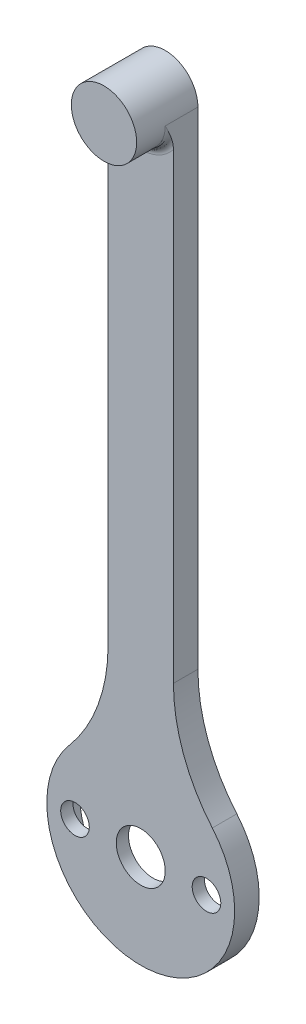
ISO-10303-21;
HEADER;
FILE_DESCRIPTION(('STEP AP214'),'2;1');
FILE_NAME('part.step','',(''),(''),'','','');
FILE_SCHEMA(('AUTOMOTIVE_DESIGN { 1 0 10303 214 1 1 1 1 }'));
ENDSEC;
DATA;
#1=APPLICATION_CONTEXT('core data for automotive mechanical design processes');
#2=APPLICATION_PROTOCOL_DEFINITION('international standard','automotive_design',2000,#1);
#3=PRODUCT_CONTEXT('',#1,'mechanical');
#4=PRODUCT('Part','Part','',(#3));
#5=PRODUCT_RELATED_PRODUCT_CATEGORY('part','',(#4));
#6=PRODUCT_DEFINITION_FORMATION('','',#4);
#7=PRODUCT_DEFINITION_CONTEXT('part definition',#1,'design');
#8=PRODUCT_DEFINITION('design','',#6,#7);
#9=PRODUCT_DEFINITION_SHAPE('','',#8);
#10=(LENGTH_UNIT() NAMED_UNIT(*) SI_UNIT(.MILLI.,.METRE.));
#11=(NAMED_UNIT(*) PLANE_ANGLE_UNIT() SI_UNIT($,.RADIAN.));
#12=(NAMED_UNIT(*) SI_UNIT($,.STERADIAN.) SOLID_ANGLE_UNIT());
#13=UNCERTAINTY_MEASURE_WITH_UNIT(LENGTH_MEASURE(1.E-05),#10,'distance_accuracy_value','');
#14=(GEOMETRIC_REPRESENTATION_CONTEXT(3) GLOBAL_UNCERTAINTY_ASSIGNED_CONTEXT((#13)) GLOBAL_UNIT_ASSIGNED_CONTEXT((#10,
#11,#12)) REPRESENTATION_CONTEXT('',''));
#15=CARTESIAN_POINT('',(0.,0.,0.));
#16=DIRECTION('',(0.,0.,1.));
#17=DIRECTION('',(1.,0.,0.));
#18=AXIS2_PLACEMENT_3D('',#15,#16,#17);
#19=CARTESIAN_POINT('',(0.,0.,3.));
#20=DIRECTION('',(0.,0.,-1.));
#21=DIRECTION('',(-1.,0.,0.));
#22=AXIS2_PLACEMENT_3D('',#19,#20,#21);
#23=CYLINDRICAL_SURFACE('',#22,4.);
#24=CARTESIAN_POINT('',(0.,0.,4.));
#25=DIRECTION('',(0.,0.,1.));
#26=DIRECTION('',(1.,0.,0.));
#27=AXIS2_PLACEMENT_3D('',#24,#25,#26);
#28=CIRCLE('',#27,4.);
#29=CARTESIAN_POINT('',(-4.,0.,4.));
#30=VERTEX_POINT('',#29);
#31=CARTESIAN_POINT('',(4.,0.,4.));
#32=VERTEX_POINT('',#31);
#33=EDGE_CURVE('E158',#30,#32,#28,.T.);
#34=ORIENTED_EDGE('',*,*,#33,.T.);
#35=DIRECTION('',(0.,0.,-1.));
#36=VECTOR('',#35,1.);
#37=CARTESIAN_POINT('',(4.,0.,3.));
#38=LINE('',#37,#36);
#39=CARTESIAN_POINT('',(4.,0.,0.));
#40=VERTEX_POINT('',#39);
#41=EDGE_CURVE('E119',#32,#40,#38,.T.);
#42=ORIENTED_EDGE('',*,*,#41,.T.);
#43=CARTESIAN_POINT('',(0.,0.,0.));
#44=DIRECTION('',(0.,0.,1.));
#45=DIRECTION('',(1.,0.,0.));
#46=AXIS2_PLACEMENT_3D('',#43,#44,#45);
#47=CIRCLE('',#46,4.);
#48=CARTESIAN_POINT('',(-4.,0.,0.));
#49=VERTEX_POINT('',#48);
#50=EDGE_CURVE('E104',#40,#49,#47,.T.);
#51=ORIENTED_EDGE('',*,*,#50,.T.);
#52=DIRECTION('',(0.,0.,-1.));
#53=VECTOR('',#52,1.);
#54=CARTESIAN_POINT('',(-4.,0.,3.));
#55=LINE('',#54,#53);
#56=EDGE_CURVE('E112',#30,#49,#55,.T.);
#57=ORIENTED_EDGE('',*,*,#56,.F.);
#58=EDGE_LOOP('',(#34,#42,#51,#57));
#59=FACE_BOUND('',#58,.T.);
#60=CARTESIAN_POINT('',(0.,0.,7.5));
#61=DIRECTION('',(0.,0.,1.));
#62=DIRECTION('',(1.,0.,0.));
#63=AXIS2_PLACEMENT_3D('',#60,#61,#62);
#64=CIRCLE('',#63,4.);
#65=CARTESIAN_POINT('',(4.,0.,7.5));
#66=VERTEX_POINT('',#65);
#67=EDGE_CURVE('E212',#66,#66,#64,.T.);
#68=ORIENTED_EDGE('',*,*,#67,.F.);
#69=EDGE_LOOP('',(#68));
#70=FACE_BOUND('',#69,.T.);
#71=ADVANCED_FACE('F37',(#59,#70),#23,.T.);
#72=CARTESIAN_POINT('',(-4.,0.,3.));
#73=DIRECTION('',(1.,0.,0.));
#74=DIRECTION('',(0.,1.,0.));
#75=AXIS2_PLACEMENT_3D('',#72,#73,#74);
#76=PLANE('',#75);
#77=DIRECTION('',(0.,-1.,0.));
#78=VECTOR('',#77,1.);
#79=CARTESIAN_POINT('',(-4.,0.,0.));
#80=LINE('',#79,#78);
#81=CARTESIAN_POINT('',(-3.99999999999999,-59.5977942368968,0.));
#82=VERTEX_POINT('',#81);
#83=EDGE_CURVE('E99',#49,#82,#80,.T.);
#84=ORIENTED_EDGE('',*,*,#83,.T.);
#85=DIRECTION('',(0.,0.,1.));
#86=VECTOR('',#85,1.);
#87=CARTESIAN_POINT('',(-3.99999999999999,-59.5977942368968,3.));
#88=LINE('',#87,#86);
#89=CARTESIAN_POINT('',(-3.99999999999999,-59.5977942368968,3.));
#90=VERTEX_POINT('',#89);
#91=EDGE_CURVE('E149',#82,#90,#88,.T.);
#92=ORIENTED_EDGE('',*,*,#91,.T.);
#93=DIRECTION('',(0.,-1.,0.));
#94=VECTOR('',#93,1.);
#95=CARTESIAN_POINT('',(-4.,0.,3.));
#96=LINE('',#95,#94);
#97=CARTESIAN_POINT('',(-4.,-3.,3.));
#98=VERTEX_POINT('',#97);
#99=EDGE_CURVE('E136',#98,#90,#96,.T.);
#100=ORIENTED_EDGE('',*,*,#99,.F.);
#101=CARTESIAN_POINT('',(-4.,-3.,3.));
#102=CARTESIAN_POINT('',(-4.,-2.94697143452369,3.00000466464602));
#103=CARTESIAN_POINT('',(-4.,-2.89396366186337,3.0015178141927));
#104=CARTESIAN_POINT('',(-4.,-2.78812547191194,3.00728594118866));
#105=CARTESIAN_POINT('',(-4.,-2.73529497080612,3.01153935660943));
#106=CARTESIAN_POINT('',(-4.,-2.57750762532174,3.02796669422958));
#107=CARTESIAN_POINT('',(-4.,-2.47292639152224,3.04381116600306));
#108=CARTESIAN_POINT('',(-4.,-2.26668985426103,3.08321299658786));
#109=CARTESIAN_POINT('',(-4.,-2.16501420398397,3.10666801763343));
#110=CARTESIAN_POINT('',(-4.,-1.96326571568565,3.15991407170182));
#111=CARTESIAN_POINT('',(-4.,-1.86319433425494,3.18971054687425));
#112=CARTESIAN_POINT('',(-4.,-1.61236736619783,3.27144712682606));
#113=CARTESIAN_POINT('',(-4.,-1.46272520420166,3.32677628807093));
#114=CARTESIAN_POINT('',(-4.,-1.16679640854904,3.44563530260113));
#115=CARTESIAN_POINT('',(-4.,-1.02051021374276,3.50916622128863));
#116=CARTESIAN_POINT('',(-4.,-0.584113242575594,3.70802482149868));
#117=CARTESIAN_POINT('',(-4.,-0.297641274995129,3.85118041116364));
#118=CARTESIAN_POINT('',(-4.,-0.00754245837293688,3.99622878552063));
#119=CARTESIAN_POINT('',(-4.,-0.00377122202375572,3.99811440402356));
#120=CARTESIAN_POINT('',(-4.,0.,4.));
#121=B_SPLINE_CURVE_WITH_KNOTS('',3,(#101,#102,#103,#104,#105,#106,#107,#108,#109,#110,#111,
#112,#113,#114,#115,#116,#117,#118,#119,#120),.UNSPECIFIED.,.F.,.F.,(4,2,2,2,2,2,2,2,2,4),(0.,
0.159031461604287,0.317972350922136,0.634872714063428,0.947677070070428,1.26075096085065,
1.73899331645924,2.21729785801988,3.17766324903917,3.19031235969807),.UNSPECIFIED.);
#122=EDGE_CURVE('E11',#98,#30,#121,.T.);
#123=ORIENTED_EDGE('',*,*,#122,.T.);
#124=ORIENTED_EDGE('',*,*,#56,.T.);
#125=EDGE_LOOP('',(#84,#92,#100,#123,#124));
#126=FACE_BOUND('',#125,.T.);
#127=ADVANCED_FACE('F113',(#126),#76,.F.);
#128=CARTESIAN_POINT('',(0.,-80.,3.));
#129=DIRECTION('',(0.,0.,-1.));
#130=DIRECTION('',(-1.,0.,0.));
#131=AXIS2_PLACEMENT_3D('',#128,#129,#130);
#132=CYLINDRICAL_SURFACE('',#131,11.5);
#133=CARTESIAN_POINT('',(0.,-80.,0.));
#134=DIRECTION('',(0.,0.,1.));
#135=DIRECTION('',(1.,0.,0.));
#136=AXIS2_PLACEMENT_3D('',#133,#134,#135);
#137=CIRCLE('',#136,11.5);
#138=CARTESIAN_POINT('',(-8.76190476190475,-72.5515756737877,0.));
#139=VERTEX_POINT('',#138);
#140=CARTESIAN_POINT('',(8.76190476190475,-72.5515756737877,0.));
#141=VERTEX_POINT('',#140);
#142=EDGE_CURVE('E110',#139,#141,#137,.T.);
#143=ORIENTED_EDGE('',*,*,#142,.T.);
#144=DIRECTION('',(0.,0.,-1.));
#145=VECTOR('',#144,1.);
#146=CARTESIAN_POINT('',(8.76190476190475,-72.5515756737877,3.));
#147=LINE('',#146,#145);
#148=CARTESIAN_POINT('',(8.76190476190475,-72.5515756737877,3.));
#149=VERTEX_POINT('',#148);
#150=EDGE_CURVE('E147',#141,#149,#147,.F.);
#151=ORIENTED_EDGE('',*,*,#150,.T.);
#152=CARTESIAN_POINT('',(0.,-80.,3.));
#153=DIRECTION('',(0.,0.,1.));
#154=DIRECTION('',(1.,0.,0.));
#155=AXIS2_PLACEMENT_3D('',#152,#153,#154);
#156=CIRCLE('',#155,11.5);
#157=CARTESIAN_POINT('',(-8.76190476190475,-72.5515756737877,3.));
#158=VERTEX_POINT('',#157);
#159=EDGE_CURVE('E203',#158,#149,#156,.T.);
#160=ORIENTED_EDGE('',*,*,#159,.F.);
#161=DIRECTION('',(0.,0.,-1.));
#162=VECTOR('',#161,1.);
#163=CARTESIAN_POINT('',(-8.76190476190475,-72.5515756737877,3.));
#164=LINE('',#163,#162);
#165=EDGE_CURVE('E144',#158,#139,#164,.T.);
#166=ORIENTED_EDGE('',*,*,#165,.T.);
#167=EDGE_LOOP('',(#143,#151,#160,#166));
#168=FACE_BOUND('',#167,.T.);
#169=ADVANCED_FACE('F177',(#168),#132,.T.);
#170=CARTESIAN_POINT('',(4.,0.,3.));
#171=DIRECTION('',(-1.,0.,0.));
#172=DIRECTION('',(0.,-1.,0.));
#173=AXIS2_PLACEMENT_3D('',#170,#171,#172);
#174=PLANE('',#173);
#175=DIRECTION('',(0.,1.,0.));
#176=VECTOR('',#175,1.);
#177=CARTESIAN_POINT('',(4.,0.,3.));
#178=LINE('',#177,#176);
#179=CARTESIAN_POINT('',(3.99999999999999,-59.5977942368968,3.));
#180=VERTEX_POINT('',#179);
#181=CARTESIAN_POINT('',(4.,-3.,3.));
#182=VERTEX_POINT('',#181);
#183=EDGE_CURVE('E129',#180,#182,#178,.T.);
#184=ORIENTED_EDGE('',*,*,#183,.F.);
#185=DIRECTION('',(0.,0.,1.));
#186=VECTOR('',#185,1.);
#187=CARTESIAN_POINT('',(3.99999999999999,-59.5977942368968,0.));
#188=LINE('',#187,#186);
#189=CARTESIAN_POINT('',(3.99999999999999,-59.5977942368968,0.));
#190=VERTEX_POINT('',#189);
#191=EDGE_CURVE('E118',#180,#190,#188,.F.);
#192=ORIENTED_EDGE('',*,*,#191,.T.);
#193=DIRECTION('',(0.,1.,0.));
#194=VECTOR('',#193,1.);
#195=CARTESIAN_POINT('',(4.,0.,0.));
#196=LINE('',#195,#194);
#197=EDGE_CURVE('E134',#190,#40,#196,.T.);
#198=ORIENTED_EDGE('',*,*,#197,.T.);
#199=ORIENTED_EDGE('',*,*,#41,.F.);
#200=CARTESIAN_POINT('',(4.,-3.,3.));
#201=CARTESIAN_POINT('',(4.,-2.94697143452369,3.00000466464602));
#202=CARTESIAN_POINT('',(4.,-2.89396366186337,3.0015178141927));
#203=CARTESIAN_POINT('',(4.,-2.78812547191194,3.00728594118866));
#204=CARTESIAN_POINT('',(4.,-2.73529497080612,3.01153935660943));
#205=CARTESIAN_POINT('',(4.,-2.57750762532174,3.02796669422958));
#206=CARTESIAN_POINT('',(4.,-2.47292639152224,3.04381116600306));
#207=CARTESIAN_POINT('',(4.,-2.26668985426103,3.08321299658786));
#208=CARTESIAN_POINT('',(4.,-2.16501420398397,3.10666801763343));
#209=CARTESIAN_POINT('',(4.,-1.96326571568565,3.15991407170182));
#210=CARTESIAN_POINT('',(4.,-1.86319433425494,3.18971054687425));
#211=CARTESIAN_POINT('',(4.,-1.61236736619783,3.27144712682606));
#212=CARTESIAN_POINT('',(4.,-1.46272520420166,3.32677628807093));
#213=CARTESIAN_POINT('',(4.,-1.16679640854904,3.44563530260113));
#214=CARTESIAN_POINT('',(4.,-1.02051021374276,3.50916622128863));
#215=CARTESIAN_POINT('',(4.,-0.584113242575594,3.70802482149868));
#216=CARTESIAN_POINT('',(4.,-0.297641274995129,3.85118041116364));
#217=CARTESIAN_POINT('',(4.,-0.00754245837293688,3.99622878552063));
#218=CARTESIAN_POINT('',(4.,-0.00377122202375572,3.99811440402356));
#219=CARTESIAN_POINT('',(4.,0.,4.));
#220=B_SPLINE_CURVE_WITH_KNOTS('',3,(#200,#201,#202,#203,#204,#205,#206,#207,#208,#209,#210,
#211,#212,#213,#214,#215,#216,#217,#218,#219),.UNSPECIFIED.,.F.,.F.,(4,2,2,2,2,2,2,2,2,4),(0.,
0.159031461604287,0.317972350922136,0.634872714063428,0.947677070070428,1.26075096085065,
1.73899331645924,2.21729785801988,3.17766324903917,3.19031235969807),.UNSPECIFIED.);
#221=EDGE_CURVE('E47',#32,#182,#220,.F.);
#222=ORIENTED_EDGE('',*,*,#221,.T.);
#223=EDGE_LOOP('',(#184,#192,#198,#199,#222));
#224=FACE_BOUND('',#223,.T.);
#225=ADVANCED_FACE('F171',(#224),#174,.F.);
#226=CARTESIAN_POINT('',(0.,0.,3.));
#227=DIRECTION('',(0.,0.,1.));
#228=DIRECTION('',(1.,0.,0.));
#229=AXIS2_PLACEMENT_3D('',#226,#227,#228);
#230=PLANE('',#229);
#231=CARTESIAN_POINT('',(-8.05,-80.,3.));
#232=DIRECTION('',(0.,0.,1.));
#233=DIRECTION('',(1.,0.,0.));
#234=AXIS2_PLACEMENT_3D('',#231,#232,#233);
#235=CIRCLE('',#234,1.75);
#236=CARTESIAN_POINT('',(-6.3,-80.,3.));
#237=VERTEX_POINT('',#236);
#238=EDGE_CURVE('E218',#237,#237,#235,.T.);
#239=ORIENTED_EDGE('',*,*,#238,.F.);
#240=EDGE_LOOP('',(#239));
#241=FACE_BOUND('',#240,.T.);
#242=CARTESIAN_POINT('',(8.05,-80.,3.));
#243=DIRECTION('',(0.,0.,1.));
#244=DIRECTION('',(1.,0.,0.));
#245=AXIS2_PLACEMENT_3D('',#242,#243,#244);
#246=CIRCLE('',#245,1.75);
#247=CARTESIAN_POINT('',(9.79999999999999,-80.,3.));
#248=VERTEX_POINT('',#247);
#249=EDGE_CURVE('E215',#248,#248,#246,.T.);
#250=ORIENTED_EDGE('',*,*,#249,.F.);
#251=EDGE_LOOP('',(#250));
#252=FACE_BOUND('',#251,.T.);
#253=ORIENTED_EDGE('',*,*,#183,.T.);
#254=CARTESIAN_POINT('',(0.,0.,3.));
#255=DIRECTION('',(0.,0.,1.));
#256=DIRECTION('',(1.,0.,0.));
#257=AXIS2_PLACEMENT_3D('',#254,#255,#256);
#258=CIRCLE('',#257,5.);
#259=EDGE_CURVE('E61',#182,#98,#258,.F.);
#260=ORIENTED_EDGE('',*,*,#259,.T.);
#261=ORIENTED_EDGE('',*,*,#99,.T.);
#262=CARTESIAN_POINT('',(-24.,-59.5977942368968,3.));
#263=DIRECTION('',(0.,0.,1.));
#264=DIRECTION('',(1.,0.,0.));
#265=AXIS2_PLACEMENT_3D('',#262,#263,#264);
#266=CIRCLE('',#265,20.);
#267=EDGE_CURVE('E156',#90,#158,#266,.F.);
#268=ORIENTED_EDGE('',*,*,#267,.T.);
#269=ORIENTED_EDGE('',*,*,#159,.T.);
#270=CARTESIAN_POINT('',(24.,-59.5977942368968,3.));
#271=DIRECTION('',(0.,0.,1.));
#272=DIRECTION('',(1.,0.,0.));
#273=AXIS2_PLACEMENT_3D('',#270,#271,#272);
#274=CIRCLE('',#273,20.);
#275=EDGE_CURVE('E153',#149,#180,#274,.F.);
#276=ORIENTED_EDGE('',*,*,#275,.T.);
#277=EDGE_LOOP('',(#253,#260,#261,#268,#269,#276));
#278=FACE_BOUND('',#277,.T.);
#279=CARTESIAN_POINT('',(0.,-80.,3.));
#280=DIRECTION('',(0.,0.,1.));
#281=DIRECTION('',(1.,0.,0.));
#282=AXIS2_PLACEMENT_3D('',#279,#280,#281);
#283=CIRCLE('',#282,3.);
#284=CARTESIAN_POINT('',(3.,-80.,3.));
#285=VERTEX_POINT('',#284);
#286=EDGE_CURVE('E141',#285,#285,#283,.T.);
#287=ORIENTED_EDGE('',*,*,#286,.F.);
#288=EDGE_LOOP('',(#287));
#289=FACE_BOUND('',#288,.T.);
#290=ADVANCED_FACE('F176',(#241,#252,#278,#289),#230,.T.);
#291=CARTESIAN_POINT('',(0.,0.,0.));
#292=DIRECTION('',(0.,0.,1.));
#293=DIRECTION('',(1.,0.,0.));
#294=AXIS2_PLACEMENT_3D('',#291,#292,#293);
#295=PLANE('',#294);
#296=CARTESIAN_POINT('',(0.,-80.,0.));
#297=DIRECTION('',(0.,0.,1.));
#298=DIRECTION('',(1.,0.,0.));
#299=AXIS2_PLACEMENT_3D('',#296,#297,#298);
#300=CIRCLE('',#299,10.5);
#301=CARTESIAN_POINT('',(10.5,-80.,0.));
#302=VERTEX_POINT('',#301);
#303=EDGE_CURVE('E126',#302,#302,#300,.T.);
#304=ORIENTED_EDGE('',*,*,#303,.T.);
#305=EDGE_LOOP('',(#304));
#306=FACE_BOUND('',#305,.T.);
#307=ORIENTED_EDGE('',*,*,#50,.F.);
#308=ORIENTED_EDGE('',*,*,#197,.F.);
#309=CARTESIAN_POINT('',(24.,-59.5977942368968,0.));
#310=DIRECTION('',(0.,0.,1.));
#311=DIRECTION('',(1.,0.,0.));
#312=AXIS2_PLACEMENT_3D('',#309,#310,#311);
#313=CIRCLE('',#312,20.);
#314=EDGE_CURVE('E151',#190,#141,#313,.T.);
#315=ORIENTED_EDGE('',*,*,#314,.T.);
#316=ORIENTED_EDGE('',*,*,#142,.F.);
#317=CARTESIAN_POINT('',(-24.,-59.5977942368968,0.));
#318=DIRECTION('',(0.,0.,1.));
#319=DIRECTION('',(1.,0.,0.));
#320=AXIS2_PLACEMENT_3D('',#317,#318,#319);
#321=CIRCLE('',#320,20.);
#322=EDGE_CURVE('E106',#139,#82,#321,.T.);
#323=ORIENTED_EDGE('',*,*,#322,.T.);
#324=ORIENTED_EDGE('',*,*,#83,.F.);
#325=EDGE_LOOP('',(#307,#308,#315,#316,#323,#324));
#326=FACE_BOUND('',#325,.T.);
#327=ADVANCED_FACE('F101',(#306,#326),#295,.F.);
#328=CARTESIAN_POINT('',(0.,-80.,1.5));
#329=DIRECTION('',(0.,0.,-1.));
#330=DIRECTION('',(-1.,0.,0.));
#331=AXIS2_PLACEMENT_3D('',#328,#329,#330);
#332=CYLINDRICAL_SURFACE('',#331,10.5);
#333=CARTESIAN_POINT('',(0.,-80.,1.5));
#334=DIRECTION('',(0.,0.,1.));
#335=DIRECTION('',(1.,0.,0.));
#336=AXIS2_PLACEMENT_3D('',#333,#334,#335);
#337=CIRCLE('',#336,10.5);
#338=CARTESIAN_POINT('',(10.5,-80.,1.5));
#339=VERTEX_POINT('',#338);
#340=EDGE_CURVE('E123',#339,#339,#337,.T.);
#341=ORIENTED_EDGE('',*,*,#340,.T.);
#342=EDGE_LOOP('',(#341));
#343=FACE_BOUND('',#342,.T.);
#344=ORIENTED_EDGE('',*,*,#303,.F.);
#345=EDGE_LOOP('',(#344));
#346=FACE_BOUND('',#345,.T.);
#347=ADVANCED_FACE('F249',(#343,#346),#332,.F.);
#348=CARTESIAN_POINT('',(0.,-80.,1.5));
#349=DIRECTION('',(0.,0.,1.));
#350=DIRECTION('',(1.,0.,0.));
#351=AXIS2_PLACEMENT_3D('',#348,#349,#350);
#352=PLANE('',#351);
#353=CARTESIAN_POINT('',(-8.05,-80.,1.5));
#354=DIRECTION('',(0.,0.,1.));
#355=DIRECTION('',(1.,0.,0.));
#356=AXIS2_PLACEMENT_3D('',#353,#354,#355);
#357=CIRCLE('',#356,1.75);
#358=CARTESIAN_POINT('',(-6.3,-80.,1.5));
#359=VERTEX_POINT('',#358);
#360=EDGE_CURVE('E42',#359,#359,#357,.T.);
#361=ORIENTED_EDGE('',*,*,#360,.T.);
#362=EDGE_LOOP('',(#361));
#363=FACE_BOUND('',#362,.T.);
#364=CARTESIAN_POINT('',(8.05,-80.,1.5));
#365=DIRECTION('',(0.,0.,1.));
#366=DIRECTION('',(1.,0.,0.));
#367=AXIS2_PLACEMENT_3D('',#364,#365,#366);
#368=CIRCLE('',#367,1.75);
#369=CARTESIAN_POINT('',(9.79999999999999,-80.,1.5));
#370=VERTEX_POINT('',#369);
#371=EDGE_CURVE('E220',#370,#370,#368,.T.);
#372=ORIENTED_EDGE('',*,*,#371,.T.);
#373=EDGE_LOOP('',(#372));
#374=FACE_BOUND('',#373,.T.);
#375=CARTESIAN_POINT('',(0.,-80.,1.5));
#376=DIRECTION('',(0.,0.,1.));
#377=DIRECTION('',(1.,0.,0.));
#378=AXIS2_PLACEMENT_3D('',#375,#376,#377);
#379=CIRCLE('',#378,3.);
#380=CARTESIAN_POINT('',(3.,-80.,1.5));
#381=VERTEX_POINT('',#380);
#382=EDGE_CURVE('E138',#381,#381,#379,.F.);
#383=ORIENTED_EDGE('',*,*,#382,.F.);
#384=EDGE_LOOP('',(#383));
#385=FACE_BOUND('',#384,.T.);
#386=ORIENTED_EDGE('',*,*,#340,.F.);
#387=EDGE_LOOP('',(#386));
#388=FACE_BOUND('',#387,.T.);
#389=ADVANCED_FACE('F229',(#363,#374,#385,#388),#352,.F.);
#390=CARTESIAN_POINT('',(0.,-80.,3.));
#391=DIRECTION('',(0.,0.,-1.));
#392=DIRECTION('',(-1.,0.,0.));
#393=AXIS2_PLACEMENT_3D('',#390,#391,#392);
#394=CYLINDRICAL_SURFACE('',#393,3.);
#395=ORIENTED_EDGE('',*,*,#286,.T.);
#396=EDGE_LOOP('',(#395));
#397=FACE_BOUND('',#396,.T.);
#398=ORIENTED_EDGE('',*,*,#382,.T.);
#399=EDGE_LOOP('',(#398));
#400=FACE_BOUND('',#399,.T.);
#401=ADVANCED_FACE('F242',(#397,#400),#394,.F.);
#402=CARTESIAN_POINT('',(0.,0.,7.5));
#403=DIRECTION('',(0.,0.,1.));
#404=DIRECTION('',(1.,0.,0.));
#405=AXIS2_PLACEMENT_3D('',#402,#403,#404);
#406=PLANE('',#405);
#407=ORIENTED_EDGE('',*,*,#67,.T.);
#408=EDGE_LOOP('',(#407));
#409=FACE_BOUND('',#408,.T.);
#410=ADVANCED_FACE('F189',(#409),#406,.T.);
#411=CARTESIAN_POINT('',(24.,-59.5977942368968,3.));
#412=DIRECTION('',(0.,0.,-1.));
#413=DIRECTION('',(-1.,0.,0.));
#414=AXIS2_PLACEMENT_3D('',#411,#412,#413);
#415=CYLINDRICAL_SURFACE('',#414,20.);
#416=ORIENTED_EDGE('',*,*,#275,.F.);
#417=ORIENTED_EDGE('',*,*,#150,.F.);
#418=ORIENTED_EDGE('',*,*,#314,.F.);
#419=ORIENTED_EDGE('',*,*,#191,.F.);
#420=EDGE_LOOP('',(#416,#417,#418,#419));
#421=FACE_BOUND('',#420,.T.);
#422=ADVANCED_FACE('F186',(#421),#415,.F.);
#423=CARTESIAN_POINT('',(-24.,-59.5977942368968,3.));
#424=DIRECTION('',(0.,0.,-1.));
#425=DIRECTION('',(-1.,0.,0.));
#426=AXIS2_PLACEMENT_3D('',#423,#424,#425);
#427=CYLINDRICAL_SURFACE('',#426,20.);
#428=ORIENTED_EDGE('',*,*,#267,.F.);
#429=ORIENTED_EDGE('',*,*,#91,.F.);
#430=ORIENTED_EDGE('',*,*,#322,.F.);
#431=ORIENTED_EDGE('',*,*,#165,.F.);
#432=EDGE_LOOP('',(#428,#429,#430,#431));
#433=FACE_BOUND('',#432,.T.);
#434=ADVANCED_FACE('F188',(#433),#427,.F.);
#435=CARTESIAN_POINT('',(0.,0.,4.));
#436=DIRECTION('',(0.,0.,1.));
#437=DIRECTION('',(1.,0.,0.));
#438=AXIS2_PLACEMENT_3D('',#435,#436,#437);
#439=TOROIDAL_SURFACE('',#438,5.,1.);
#440=ORIENTED_EDGE('',*,*,#122,.F.);
#441=ORIENTED_EDGE('',*,*,#259,.F.);
#442=ORIENTED_EDGE('',*,*,#221,.F.);
#443=ORIENTED_EDGE('',*,*,#33,.F.);
#444=EDGE_LOOP('',(#440,#441,#442,#443));
#445=FACE_BOUND('',#444,.T.);
#446=ADVANCED_FACE('F39',(#445),#439,.F.);
#447=CARTESIAN_POINT('',(8.05,-80.,0.));
#448=DIRECTION('',(0.,0.,1.));
#449=DIRECTION('',(1.,0.,0.));
#450=AXIS2_PLACEMENT_3D('',#447,#448,#449);
#451=CYLINDRICAL_SURFACE('',#450,1.75);
#452=ORIENTED_EDGE('',*,*,#249,.T.);
#453=EDGE_LOOP('',(#452));
#454=FACE_BOUND('',#453,.T.);
#455=ORIENTED_EDGE('',*,*,#371,.F.);
#456=EDGE_LOOP('',(#455));
#457=FACE_BOUND('',#456,.T.);
#458=ADVANCED_FACE('F196',(#454,#457),#451,.F.);
#459=CARTESIAN_POINT('',(-8.05,-80.,0.));
#460=DIRECTION('',(0.,0.,1.));
#461=DIRECTION('',(1.,0.,0.));
#462=AXIS2_PLACEMENT_3D('',#459,#460,#461);
#463=CYLINDRICAL_SURFACE('',#462,1.75);
#464=ORIENTED_EDGE('',*,*,#238,.T.);
#465=EDGE_LOOP('',(#464));
#466=FACE_BOUND('',#465,.T.);
#467=ORIENTED_EDGE('',*,*,#360,.F.);
#468=EDGE_LOOP('',(#467));
#469=FACE_BOUND('',#468,.T.);
#470=ADVANCED_FACE('F231',(#466,#469),#463,.F.);
#471=CLOSED_SHELL('',(#71,#127,#169,#225,#290,#327,#347,#389,#401,#410,#422,#434,#446,#458,#470));
#472=MANIFOLD_SOLID_BREP('B2',#471);
#473=ADVANCED_BREP_SHAPE_REPRESENTATION('',(#18,#472),#14);
#474=SHAPE_DEFINITION_REPRESENTATION(#9,#473);
ENDSEC;
END-ISO-10303-21;
